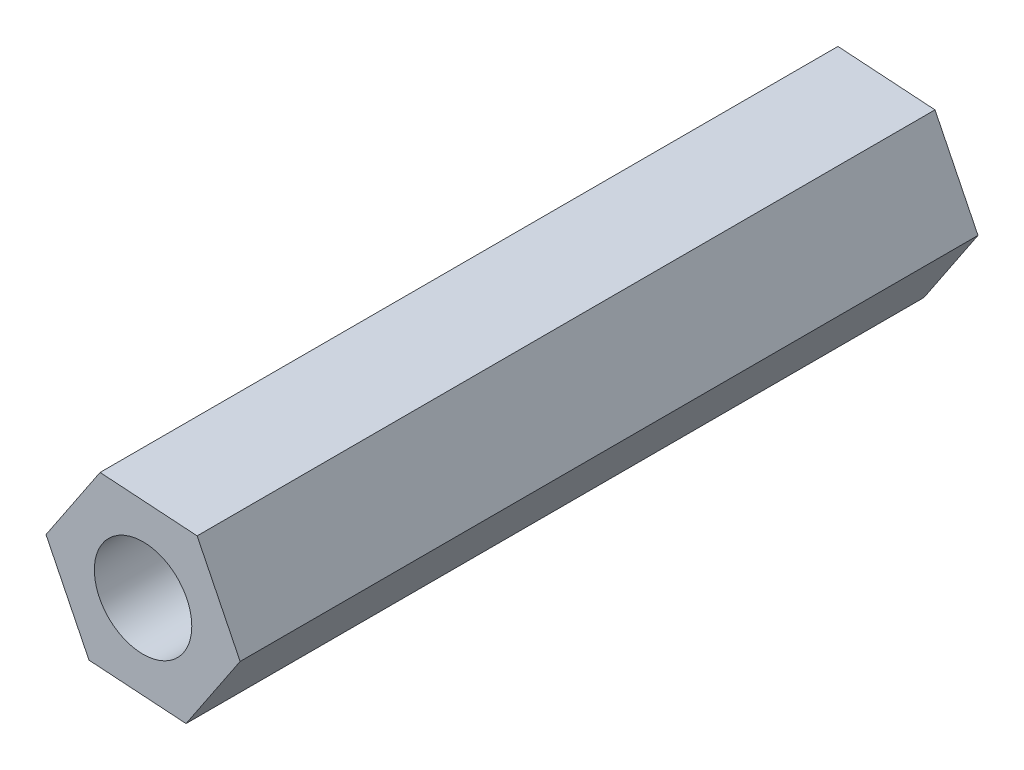
ISO-10303-21;
HEADER;
FILE_DESCRIPTION(('STEP AP214'),'2;1');
FILE_NAME('part.step','',(''),(''),'','','');
FILE_SCHEMA(('AUTOMOTIVE_DESIGN { 1 0 10303 214 1 1 1 1 }'));
ENDSEC;
DATA;
#1=APPLICATION_CONTEXT('core data for automotive mechanical design processes');
#2=APPLICATION_PROTOCOL_DEFINITION('international standard','automotive_design',2000,#1);
#3=PRODUCT_CONTEXT('',#1,'mechanical');
#4=PRODUCT('Part','Part','',(#3));
#5=PRODUCT_RELATED_PRODUCT_CATEGORY('part','',(#4));
#6=PRODUCT_DEFINITION_FORMATION('','',#4);
#7=PRODUCT_DEFINITION_CONTEXT('part definition',#1,'design');
#8=PRODUCT_DEFINITION('design','',#6,#7);
#9=PRODUCT_DEFINITION_SHAPE('','',#8);
#10=(LENGTH_UNIT() NAMED_UNIT(*) SI_UNIT(.MILLI.,.METRE.));
#11=(NAMED_UNIT(*) PLANE_ANGLE_UNIT() SI_UNIT($,.RADIAN.));
#12=(NAMED_UNIT(*) SI_UNIT($,.STERADIAN.) SOLID_ANGLE_UNIT());
#13=UNCERTAINTY_MEASURE_WITH_UNIT(LENGTH_MEASURE(1.E-05),#10,'distance_accuracy_value','');
#14=(GEOMETRIC_REPRESENTATION_CONTEXT(3) GLOBAL_UNCERTAINTY_ASSIGNED_CONTEXT((#13)) GLOBAL_UNIT_ASSIGNED_CONTEXT((#10,
#11,#12)) REPRESENTATION_CONTEXT('',''));
#15=CARTESIAN_POINT('',(0.,0.,0.));
#16=DIRECTION('',(0.,0.,1.));
#17=DIRECTION('',(1.,0.,0.));
#18=AXIS2_PLACEMENT_3D('',#15,#16,#17);
#19=CARTESIAN_POINT('',(0.,0.,25.));
#20=DIRECTION('',(0.,0.,1.));
#21=DIRECTION('',(1.,0.,0.));
#22=AXIS2_PLACEMENT_3D('',#19,#20,#21);
#23=PLANE('',#22);
#24=DIRECTION('',(-0.99783333809281,0.0657923201487778,0.));
#25=VECTOR('',#24,1.);
#26=CARTESIAN_POINT('',(635.272200562485,-1285.5511193338,25.));
#27=LINE('',#26,#25);
#28=CARTESIAN_POINT('',(635.272200562485,-1285.5511193338,25.));
#29=VERTEX_POINT('',#28);
#30=CARTESIAN_POINT('',(631.983625936232,-1285.33428657588,25.));
#31=VERTEX_POINT('',#30);
#32=EDGE_CURVE('E135',#29,#31,#27,.T.);
#33=ORIENTED_EDGE('',*,*,#32,.T.);
#34=DIRECTION('',(-0.555894489669142,-0.831252859457027,0.));
#35=VECTOR('',#34,1.);
#36=CARTESIAN_POINT('',(631.983625936232,-1285.33428657588,25.));
#37=LINE('',#36,#35);
#38=CARTESIAN_POINT('',(630.151555946374,-1288.0738593655,25.));
#39=VERTEX_POINT('',#38);
#40=EDGE_CURVE('E93',#31,#39,#37,.T.);
#41=ORIENTED_EDGE('',*,*,#40,.T.);
#42=DIRECTION('',(0.44193884842365,-0.897045179605787,0.));
#43=VECTOR('',#42,1.);
#44=CARTESIAN_POINT('',(630.151555946374,-1288.0738593655,25.));
#45=LINE('',#44,#43);
#46=CARTESIAN_POINT('',(631.608060582769,-1291.03026491303,25.));
#47=VERTEX_POINT('',#46);
#48=EDGE_CURVE('E106',#39,#47,#45,.T.);
#49=ORIENTED_EDGE('',*,*,#48,.T.);
#50=DIRECTION('',(0.99783333809281,-0.0657923201487867,0.));
#51=VECTOR('',#50,1.);
#52=CARTESIAN_POINT('',(631.608060582769,-1291.03026491303,25.));
#53=LINE('',#52,#51);
#54=CARTESIAN_POINT('',(634.896635209021,-1291.24709767095,25.));
#55=VERTEX_POINT('',#54);
#56=EDGE_CURVE('E100',#47,#55,#53,.T.);
#57=ORIENTED_EDGE('',*,*,#56,.T.);
#58=DIRECTION('',(0.55589448966918,0.831252859457001,0.));
#59=VECTOR('',#58,1.);
#60=CARTESIAN_POINT('',(634.896635209021,-1291.24709767095,25.));
#61=LINE('',#60,#59);
#62=CARTESIAN_POINT('',(636.728705198879,-1288.50752488134,25.));
#63=VERTEX_POINT('',#62);
#64=EDGE_CURVE('E104',#55,#63,#61,.T.);
#65=ORIENTED_EDGE('',*,*,#64,.T.);
#66=DIRECTION('',(-0.441938848423649,0.897045179605787,0.));
#67=VECTOR('',#66,1.);
#68=CARTESIAN_POINT('',(636.728705198879,-1288.50752488134,25.));
#69=LINE('',#68,#67);
#70=EDGE_CURVE('E56',#63,#29,#69,.T.);
#71=ORIENTED_EDGE('',*,*,#70,.T.);
#72=EDGE_LOOP('',(#33,#41,#49,#57,#65,#71));
#73=FACE_BOUND('',#72,.T.);
#74=CARTESIAN_POINT('',(633.440130572627,-1288.29069212342,25.));
#75=DIRECTION('',(0.,0.,1.));
#76=DIRECTION('',(1.,0.,0.));
#77=AXIS2_PLACEMENT_3D('',#74,#75,#76);
#78=CIRCLE('',#77,1.65099999999989);
#79=CARTESIAN_POINT('',(635.091130572627,-1288.29069212342,25.));
#80=VERTEX_POINT('',#79);
#81=EDGE_CURVE('E128',#80,#80,#78,.T.);
#82=ORIENTED_EDGE('',*,*,#81,.F.);
#83=EDGE_LOOP('',(#82));
#84=FACE_BOUND('',#83,.T.);
#85=ADVANCED_FACE('F39',(#73,#84),#23,.T.);
#86=CARTESIAN_POINT('',(0.,0.,0.));
#87=DIRECTION('',(0.,0.,1.));
#88=DIRECTION('',(1.,0.,0.));
#89=AXIS2_PLACEMENT_3D('',#86,#87,#88);
#90=PLANE('',#89);
#91=DIRECTION('',(-0.99783333809281,0.0657923201487778,0.));
#92=VECTOR('',#91,1.);
#93=CARTESIAN_POINT('',(635.272200562485,-1285.5511193338,0.));
#94=LINE('',#93,#92);
#95=CARTESIAN_POINT('',(635.272200562485,-1285.5511193338,0.));
#96=VERTEX_POINT('',#95);
#97=CARTESIAN_POINT('',(631.983625936232,-1285.33428657588,0.));
#98=VERTEX_POINT('',#97);
#99=EDGE_CURVE('E124',#96,#98,#94,.T.);
#100=ORIENTED_EDGE('',*,*,#99,.F.);
#101=DIRECTION('',(-0.441938848423649,0.897045179605787,0.));
#102=VECTOR('',#101,1.);
#103=CARTESIAN_POINT('',(636.728705198879,-1288.50752488134,0.));
#104=LINE('',#103,#102);
#105=CARTESIAN_POINT('',(636.728705198879,-1288.50752488134,0.));
#106=VERTEX_POINT('',#105);
#107=EDGE_CURVE('E85',#106,#96,#104,.T.);
#108=ORIENTED_EDGE('',*,*,#107,.F.);
#109=DIRECTION('',(0.55589448966918,0.831252859457001,0.));
#110=VECTOR('',#109,1.);
#111=CARTESIAN_POINT('',(634.896635209021,-1291.24709767095,0.));
#112=LINE('',#111,#110);
#113=CARTESIAN_POINT('',(634.896635209021,-1291.24709767095,0.));
#114=VERTEX_POINT('',#113);
#115=EDGE_CURVE('E79',#114,#106,#112,.T.);
#116=ORIENTED_EDGE('',*,*,#115,.F.);
#117=DIRECTION('',(0.99783333809281,-0.0657923201487867,0.));
#118=VECTOR('',#117,1.);
#119=CARTESIAN_POINT('',(631.608060582769,-1291.03026491303,0.));
#120=LINE('',#119,#118);
#121=CARTESIAN_POINT('',(631.608060582769,-1291.03026491303,0.));
#122=VERTEX_POINT('',#121);
#123=EDGE_CURVE('E114',#122,#114,#120,.T.);
#124=ORIENTED_EDGE('',*,*,#123,.F.);
#125=DIRECTION('',(0.44193884842365,-0.897045179605787,0.));
#126=VECTOR('',#125,1.);
#127=CARTESIAN_POINT('',(630.151555946374,-1288.0738593655,0.));
#128=LINE('',#127,#126);
#129=CARTESIAN_POINT('',(630.151555946374,-1288.0738593655,0.));
#130=VERTEX_POINT('',#129);
#131=EDGE_CURVE('E130',#130,#122,#128,.T.);
#132=ORIENTED_EDGE('',*,*,#131,.F.);
#133=DIRECTION('',(-0.555894489669142,-0.831252859457027,0.));
#134=VECTOR('',#133,1.);
#135=CARTESIAN_POINT('',(631.983625936232,-1285.33428657588,0.));
#136=LINE('',#135,#134);
#137=EDGE_CURVE('E127',#98,#130,#136,.T.);
#138=ORIENTED_EDGE('',*,*,#137,.F.);
#139=EDGE_LOOP('',(#100,#108,#116,#124,#132,#138));
#140=FACE_BOUND('',#139,.T.);
#141=CARTESIAN_POINT('',(633.440130572627,-1288.29069212342,0.));
#142=DIRECTION('',(0.,0.,1.));
#143=DIRECTION('',(1.,0.,0.));
#144=AXIS2_PLACEMENT_3D('',#141,#142,#143);
#145=CIRCLE('',#144,1.65099999999989);
#146=CARTESIAN_POINT('',(635.091130572627,-1288.29069212342,0.));
#147=VERTEX_POINT('',#146);
#148=EDGE_CURVE('E228',#147,#147,#145,.T.);
#149=ORIENTED_EDGE('',*,*,#148,.T.);
#150=EDGE_LOOP('',(#149));
#151=FACE_BOUND('',#150,.T.);
#152=ADVANCED_FACE('F144',(#140,#151),#90,.F.);
#153=CARTESIAN_POINT('',(635.272200562485,-1285.5511193338,25.));
#154=DIRECTION('',(-0.0657923201487778,-0.99783333809281,0.));
#155=DIRECTION('',(0.99783333809281,-0.0657923201487778,0.));
#156=AXIS2_PLACEMENT_3D('',#153,#154,#155);
#157=PLANE('',#156);
#158=ORIENTED_EDGE('',*,*,#99,.T.);
#159=DIRECTION('',(0.,0.,-1.));
#160=VECTOR('',#159,1.);
#161=CARTESIAN_POINT('',(631.983625936232,-1285.33428657588,25.));
#162=LINE('',#161,#160);
#163=EDGE_CURVE('E11',#31,#98,#162,.T.);
#164=ORIENTED_EDGE('',*,*,#163,.F.);
#165=ORIENTED_EDGE('',*,*,#32,.F.);
#166=DIRECTION('',(0.,0.,-1.));
#167=VECTOR('',#166,1.);
#168=CARTESIAN_POINT('',(635.272200562485,-1285.5511193338,25.));
#169=LINE('',#168,#167);
#170=EDGE_CURVE('E120',#29,#96,#169,.T.);
#171=ORIENTED_EDGE('',*,*,#170,.T.);
#172=EDGE_LOOP('',(#158,#164,#165,#171));
#173=FACE_BOUND('',#172,.T.);
#174=ADVANCED_FACE('F41',(#173),#157,.F.);
#175=CARTESIAN_POINT('',(631.983625936232,-1285.33428657588,25.));
#176=DIRECTION('',(0.831252859457027,-0.555894489669142,0.));
#177=DIRECTION('',(0.555894489669142,0.831252859457027,0.));
#178=AXIS2_PLACEMENT_3D('',#175,#176,#177);
#179=PLANE('',#178);
#180=ORIENTED_EDGE('',*,*,#137,.T.);
#181=DIRECTION('',(0.,0.,-1.));
#182=VECTOR('',#181,1.);
#183=CARTESIAN_POINT('',(630.151555946374,-1288.0738593655,25.));
#184=LINE('',#183,#182);
#185=EDGE_CURVE('E48',#39,#130,#184,.T.);
#186=ORIENTED_EDGE('',*,*,#185,.F.);
#187=ORIENTED_EDGE('',*,*,#40,.F.);
#188=ORIENTED_EDGE('',*,*,#163,.T.);
#189=EDGE_LOOP('',(#180,#186,#187,#188));
#190=FACE_BOUND('',#189,.T.);
#191=ADVANCED_FACE('F169',(#190),#179,.F.);
#192=CARTESIAN_POINT('',(630.151555946374,-1288.0738593655,25.));
#193=DIRECTION('',(0.897045179605787,0.44193884842365,0.));
#194=DIRECTION('',(-0.44193884842365,0.897045179605787,0.));
#195=AXIS2_PLACEMENT_3D('',#192,#193,#194);
#196=PLANE('',#195);
#197=ORIENTED_EDGE('',*,*,#131,.T.);
#198=DIRECTION('',(0.,0.,-1.));
#199=VECTOR('',#198,1.);
#200=CARTESIAN_POINT('',(631.608060582769,-1291.03026491303,25.));
#201=LINE('',#200,#199);
#202=EDGE_CURVE('E115',#47,#122,#201,.T.);
#203=ORIENTED_EDGE('',*,*,#202,.F.);
#204=ORIENTED_EDGE('',*,*,#48,.F.);
#205=ORIENTED_EDGE('',*,*,#185,.T.);
#206=EDGE_LOOP('',(#197,#203,#204,#205));
#207=FACE_BOUND('',#206,.T.);
#208=ADVANCED_FACE('F141',(#207),#196,.F.);
#209=CARTESIAN_POINT('',(631.608060582769,-1291.03026491303,25.));
#210=DIRECTION('',(0.0657923201487867,0.99783333809281,0.));
#211=DIRECTION('',(-0.99783333809281,0.0657923201487867,0.));
#212=AXIS2_PLACEMENT_3D('',#209,#210,#211);
#213=PLANE('',#212);
#214=ORIENTED_EDGE('',*,*,#123,.T.);
#215=DIRECTION('',(0.,0.,-1.));
#216=VECTOR('',#215,1.);
#217=CARTESIAN_POINT('',(634.896635209021,-1291.24709767095,25.));
#218=LINE('',#217,#216);
#219=EDGE_CURVE('E111',#55,#114,#218,.T.);
#220=ORIENTED_EDGE('',*,*,#219,.F.);
#221=ORIENTED_EDGE('',*,*,#56,.F.);
#222=ORIENTED_EDGE('',*,*,#202,.T.);
#223=EDGE_LOOP('',(#214,#220,#221,#222));
#224=FACE_BOUND('',#223,.T.);
#225=ADVANCED_FACE('F112',(#224),#213,.F.);
#226=CARTESIAN_POINT('',(634.896635209021,-1291.24709767095,25.));
#227=DIRECTION('',(-0.831252859457001,0.55589448966918,0.));
#228=DIRECTION('',(-0.555894489669181,-0.831252859457002,0.));
#229=AXIS2_PLACEMENT_3D('',#226,#227,#228);
#230=PLANE('',#229);
#231=ORIENTED_EDGE('',*,*,#115,.T.);
#232=DIRECTION('',(0.,0.,-1.));
#233=VECTOR('',#232,1.);
#234=CARTESIAN_POINT('',(636.728705198879,-1288.50752488134,25.));
#235=LINE('',#234,#233);
#236=EDGE_CURVE('E116',#63,#106,#235,.T.);
#237=ORIENTED_EDGE('',*,*,#236,.F.);
#238=ORIENTED_EDGE('',*,*,#64,.F.);
#239=ORIENTED_EDGE('',*,*,#219,.T.);
#240=EDGE_LOOP('',(#231,#237,#238,#239));
#241=FACE_BOUND('',#240,.T.);
#242=ADVANCED_FACE('F118',(#241),#230,.F.);
#243=CARTESIAN_POINT('',(636.728705198879,-1288.50752488134,25.));
#244=DIRECTION('',(-0.897045179605787,-0.441938848423649,0.));
#245=DIRECTION('',(0.441938848423649,-0.897045179605787,0.));
#246=AXIS2_PLACEMENT_3D('',#243,#244,#245);
#247=PLANE('',#246);
#248=ORIENTED_EDGE('',*,*,#107,.T.);
#249=ORIENTED_EDGE('',*,*,#170,.F.);
#250=ORIENTED_EDGE('',*,*,#70,.F.);
#251=ORIENTED_EDGE('',*,*,#236,.T.);
#252=EDGE_LOOP('',(#248,#249,#250,#251));
#253=FACE_BOUND('',#252,.T.);
#254=ADVANCED_FACE('F149',(#253),#247,.F.);
#255=CARTESIAN_POINT('',(633.440130572627,-1288.29069212342,25.));
#256=DIRECTION('',(0.,0.,-1.));
#257=DIRECTION('',(-1.,0.,0.));
#258=AXIS2_PLACEMENT_3D('',#255,#256,#257);
#259=CYLINDRICAL_SURFACE('',#258,1.65099999999989);
#260=ORIENTED_EDGE('',*,*,#81,.T.);
#261=EDGE_LOOP('',(#260));
#262=FACE_BOUND('',#261,.T.);
#263=ORIENTED_EDGE('',*,*,#148,.F.);
#264=EDGE_LOOP('',(#263));
#265=FACE_BOUND('',#264,.T.);
#266=ADVANCED_FACE('F151',(#262,#265),#259,.F.);
#267=CLOSED_SHELL('',(#85,#152,#174,#191,#208,#225,#242,#254,#266));
#268=MANIFOLD_SOLID_BREP('B2',#267);
#269=ADVANCED_BREP_SHAPE_REPRESENTATION('',(#18,#268),#14);
#270=SHAPE_DEFINITION_REPRESENTATION(#9,#269);
ENDSEC;
END-ISO-10303-21;
